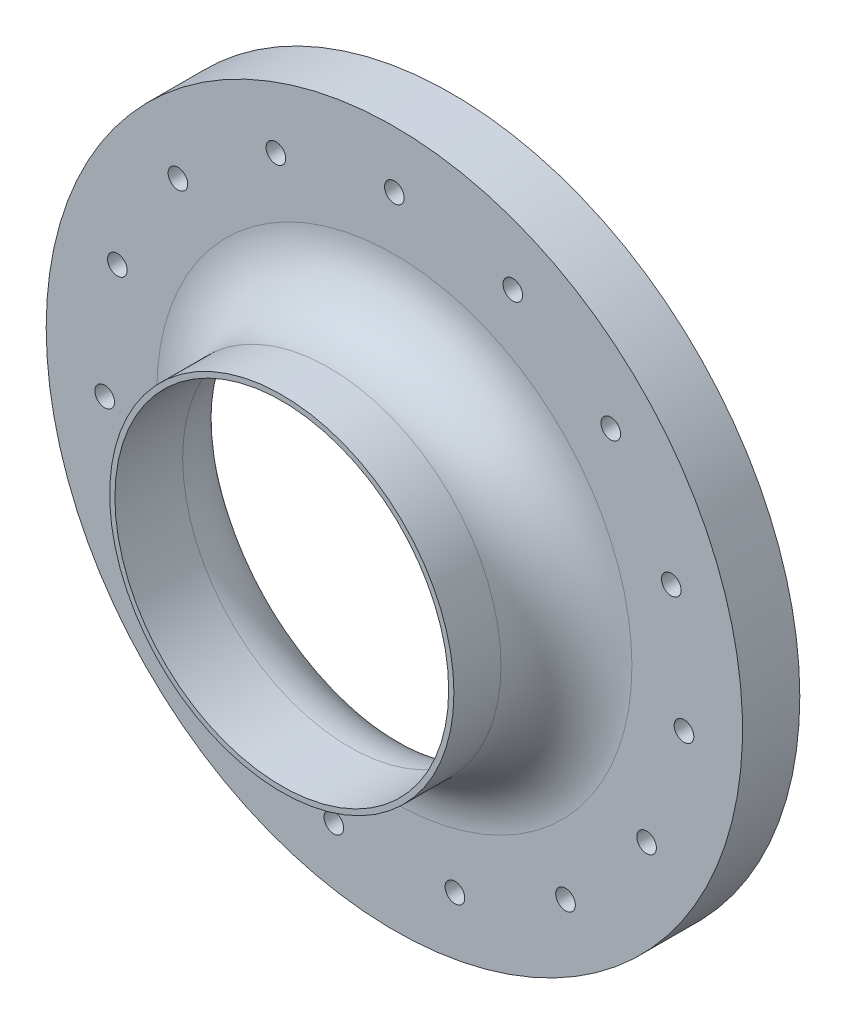
ISO-10303-21;
HEADER;
FILE_DESCRIPTION(('STEP AP214'),'2;1');
FILE_NAME('part.step','',(''),(''),'','','');
FILE_SCHEMA(('AUTOMOTIVE_DESIGN { 1 0 10303 214 1 1 1 1 }'));
ENDSEC;
DATA;
#1=APPLICATION_CONTEXT('core data for automotive mechanical design processes');
#2=APPLICATION_PROTOCOL_DEFINITION('international standard','automotive_design',2000,#1);
#3=PRODUCT_CONTEXT('',#1,'mechanical');
#4=PRODUCT('Part','Part','',(#3));
#5=PRODUCT_RELATED_PRODUCT_CATEGORY('part','',(#4));
#6=PRODUCT_DEFINITION_FORMATION('','',#4);
#7=PRODUCT_DEFINITION_CONTEXT('part definition',#1,'design');
#8=PRODUCT_DEFINITION('design','',#6,#7);
#9=PRODUCT_DEFINITION_SHAPE('','',#8);
#10=(LENGTH_UNIT() NAMED_UNIT(*) SI_UNIT(.MILLI.,.METRE.));
#11=(NAMED_UNIT(*) PLANE_ANGLE_UNIT() SI_UNIT($,.RADIAN.));
#12=(NAMED_UNIT(*) SI_UNIT($,.STERADIAN.) SOLID_ANGLE_UNIT());
#13=UNCERTAINTY_MEASURE_WITH_UNIT(LENGTH_MEASURE(1.E-05),#10,'distance_accuracy_value','');
#14=(GEOMETRIC_REPRESENTATION_CONTEXT(3) GLOBAL_UNCERTAINTY_ASSIGNED_CONTEXT((#13)) GLOBAL_UNIT_ASSIGNED_CONTEXT((#10,
#11,#12)) REPRESENTATION_CONTEXT('',''));
#15=CARTESIAN_POINT('',(0.,0.,0.));
#16=DIRECTION('',(0.,0.,1.));
#17=DIRECTION('',(1.,0.,0.));
#18=AXIS2_PLACEMENT_3D('',#15,#16,#17);
#19=CARTESIAN_POINT('',(0.,0.,-27.8));
#20=DIRECTION('',(0.,0.,1.));
#21=DIRECTION('',(1.,0.,0.));
#22=AXIS2_PLACEMENT_3D('',#19,#20,#21);
#23=TOROIDAL_SURFACE('',#22,46.5,6.95000000000001);
#24=CARTESIAN_POINT('',(0.,0.,-20.85));
#25=DIRECTION('',(0.,0.,1.));
#26=DIRECTION('',(1.,0.,0.));
#27=AXIS2_PLACEMENT_3D('',#24,#25,#26);
#28=CIRCLE('',#27,46.5);
#29=CARTESIAN_POINT('',(46.5,0.,-20.85));
#30=VERTEX_POINT('',#29);
#31=EDGE_CURVE('E51',#30,#30,#28,.T.);
#32=ORIENTED_EDGE('',*,*,#31,.T.);
#33=EDGE_LOOP('',(#32));
#34=FACE_BOUND('',#33,.T.);
#35=CARTESIAN_POINT('',(0.,0.,-25.9527046798089));
#36=DIRECTION('',(0.,0.,-1.));
#37=DIRECTION('',(-1.,0.,0.));
#38=AXIS2_PLACEMENT_3D('',#35,#36,#37);
#39=CIRCLE('',#38,53.2);
#40=CARTESIAN_POINT('',(-53.2,0.,-25.9527046798089));
#41=VERTEX_POINT('',#40);
#42=EDGE_CURVE('E121',#41,#41,#39,.F.);
#43=ORIENTED_EDGE('',*,*,#42,.F.);
#44=EDGE_LOOP('',(#43));
#45=FACE_BOUND('',#44,.T.);
#46=ADVANCED_FACE('F39',(#34,#45),#23,.F.);
#47=CARTESIAN_POINT('',(0.,36.3,-17.2));
#48=DIRECTION('',(0.,0.,-1.));
#49=DIRECTION('',(-1.,0.,0.));
#50=AXIS2_PLACEMENT_3D('',#47,#48,#49);
#51=PLANE('',#50);
#52=CARTESIAN_POINT('',(0.,0.,-17.2));
#53=DIRECTION('',(0.,0.,1.));
#54=DIRECTION('',(1.,0.,0.));
#55=AXIS2_PLACEMENT_3D('',#52,#53,#54);
#56=CIRCLE('',#55,36.3);
#57=CARTESIAN_POINT('',(36.3,0.,-17.2));
#58=VERTEX_POINT('',#57);
#59=EDGE_CURVE('E56',#58,#58,#56,.T.);
#60=ORIENTED_EDGE('',*,*,#59,.F.);
#61=EDGE_LOOP('',(#60));
#62=FACE_BOUND('',#61,.T.);
#63=CARTESIAN_POINT('',(0.,44.5,-17.2));
#64=DIRECTION('',(0.,0.,1.));
#65=DIRECTION('',(1.,0.,0.));
#66=AXIS2_PLACEMENT_3D('',#63,#64,#65);
#67=CIRCLE('',#66,1.5);
#68=CARTESIAN_POINT('',(1.5,44.5,-17.2));
#69=VERTEX_POINT('',#68);
#70=EDGE_CURVE('E71',#69,#69,#67,.T.);
#71=ORIENTED_EDGE('',*,*,#70,.F.);
#72=EDGE_LOOP('',(#71));
#73=FACE_BOUND('',#72,.T.);
#74=CARTESIAN_POINT('',(-18.0997806168731,40.6527728650957,-17.2));
#75=DIRECTION('',(0.,0.,1.));
#76=DIRECTION('',(1.,0.,0.));
#77=AXIS2_PLACEMENT_3D('',#74,#75,#76);
#78=CIRCLE('',#77,1.5);
#79=CARTESIAN_POINT('',(-16.5997806168731,40.6527728650957,-17.2));
#80=VERTEX_POINT('',#79);
#81=EDGE_CURVE('E117',#80,#80,#78,.T.);
#82=ORIENTED_EDGE('',*,*,#81,.F.);
#83=EDGE_LOOP('',(#82));
#84=FACE_BOUND('',#83,.T.);
#85=CARTESIAN_POINT('',(-33.0699447337441,29.7763119829692,-17.2));
#86=DIRECTION('',(0.,0.,1.));
#87=DIRECTION('',(1.,0.,0.));
#88=AXIS2_PLACEMENT_3D('',#85,#86,#87);
#89=CIRCLE('',#88,1.5);
#90=CARTESIAN_POINT('',(-31.5699447337441,29.7763119829692,-17.2));
#91=VERTEX_POINT('',#90);
#92=EDGE_CURVE('E120',#91,#91,#89,.T.);
#93=ORIENTED_EDGE('',*,*,#92,.F.);
#94=EDGE_LOOP('',(#93));
#95=FACE_BOUND('',#94,.T.);
#96=CARTESIAN_POINT('',(-42.3220149751344,13.7512562496852,-17.2));
#97=DIRECTION('',(0.,0.,1.));
#98=DIRECTION('',(1.,0.,0.));
#99=AXIS2_PLACEMENT_3D('',#96,#97,#98);
#100=CIRCLE('',#99,1.50000000000103);
#101=CARTESIAN_POINT('',(-40.8220149751333,13.7512562496852,-17.2));
#102=VERTEX_POINT('',#101);
#103=EDGE_CURVE('E124',#102,#102,#100,.T.);
#104=ORIENTED_EDGE('',*,*,#103,.F.);
#105=EDGE_LOOP('',(#104));
#106=FACE_BOUND('',#105,.T.);
#107=CARTESIAN_POINT('',(-44.2562243438882,-4.65151661541059,-17.2));
#108=DIRECTION('',(0.,0.,1.));
#109=DIRECTION('',(1.,0.,0.));
#110=AXIS2_PLACEMENT_3D('',#107,#108,#109);
#111=CIRCLE('',#110,1.50000000000126);
#112=CARTESIAN_POINT('',(-42.7562243438869,-4.65151661541059,-17.2));
#113=VERTEX_POINT('',#112);
#114=EDGE_CURVE('E127',#113,#113,#111,.T.);
#115=ORIENTED_EDGE('',*,*,#114,.F.);
#116=EDGE_LOOP('',(#115));
#117=FACE_BOUND('',#116,.T.);
#118=CARTESIAN_POINT('',(-38.5381304684076,-22.25,-17.2));
#119=DIRECTION('',(0.,0.,1.));
#120=DIRECTION('',(1.,0.,0.));
#121=AXIS2_PLACEMENT_3D('',#118,#119,#120);
#122=CIRCLE('',#121,1.50000000000039);
#123=CARTESIAN_POINT('',(-37.0381304684072,-22.25,-17.2));
#124=VERTEX_POINT('',#123);
#125=EDGE_CURVE('E130',#124,#124,#122,.T.);
#126=ORIENTED_EDGE('',*,*,#125,.F.);
#127=EDGE_LOOP('',(#126));
#128=FACE_BOUND('',#127,.T.);
#129=CARTESIAN_POINT('',(-26.1564437270151,-36.0012562496852,-17.2));
#130=DIRECTION('',(0.,0.,1.));
#131=DIRECTION('',(1.,0.,0.));
#132=AXIS2_PLACEMENT_3D('',#129,#130,#131);
#133=CIRCLE('',#132,1.50000000000034);
#134=CARTESIAN_POINT('',(-24.6564437270147,-36.0012562496852,-17.2));
#135=VERTEX_POINT('',#134);
#136=EDGE_CURVE('E133',#135,#135,#133,.T.);
#137=ORIENTED_EDGE('',*,*,#136,.F.);
#138=EDGE_LOOP('',(#137));
#139=FACE_BOUND('',#138,.T.);
#140=CARTESIAN_POINT('',(-9.25207024139029,-43.5275682326544,-17.2));
#141=DIRECTION('',(0.,0.,1.));
#142=DIRECTION('',(1.,0.,0.));
#143=AXIS2_PLACEMENT_3D('',#140,#141,#142);
#144=CIRCLE('',#143,1.50000000000031);
#145=CARTESIAN_POINT('',(-7.75207024138998,-43.5275682326544,-17.2));
#146=VERTEX_POINT('',#145);
#147=EDGE_CURVE('E136',#146,#146,#144,.T.);
#148=ORIENTED_EDGE('',*,*,#147,.F.);
#149=EDGE_LOOP('',(#148));
#150=FACE_BOUND('',#149,.T.);
#151=CARTESIAN_POINT('',(9.2520702413903,-43.5275682326544,-17.2));
#152=DIRECTION('',(0.,0.,1.));
#153=DIRECTION('',(1.,0.,0.));
#154=AXIS2_PLACEMENT_3D('',#151,#152,#153);
#155=CIRCLE('',#154,1.50000000000026);
#156=CARTESIAN_POINT('',(10.7520702413906,-43.5275682326544,-17.2));
#157=VERTEX_POINT('',#156);
#158=EDGE_CURVE('E139',#157,#157,#155,.T.);
#159=ORIENTED_EDGE('',*,*,#158,.F.);
#160=EDGE_LOOP('',(#159));
#161=FACE_BOUND('',#160,.T.);
#162=CARTESIAN_POINT('',(26.1564437270151,-36.0012562496852,-17.2));
#163=DIRECTION('',(0.,0.,1.));
#164=DIRECTION('',(1.,0.,0.));
#165=AXIS2_PLACEMENT_3D('',#162,#163,#164);
#166=CIRCLE('',#165,1.50000000000021);
#167=CARTESIAN_POINT('',(27.6564437270153,-36.0012562496852,-17.2));
#168=VERTEX_POINT('',#167);
#169=EDGE_CURVE('E142',#168,#168,#166,.T.);
#170=ORIENTED_EDGE('',*,*,#169,.F.);
#171=EDGE_LOOP('',(#170));
#172=FACE_BOUND('',#171,.T.);
#173=CARTESIAN_POINT('',(38.5381304684075,-22.25,-17.2));
#174=DIRECTION('',(0.,0.,1.));
#175=DIRECTION('',(1.,0.,0.));
#176=AXIS2_PLACEMENT_3D('',#173,#174,#175);
#177=CIRCLE('',#176,1.5000000000002);
#178=CARTESIAN_POINT('',(40.0381304684077,-22.25,-17.2));
#179=VERTEX_POINT('',#178);
#180=EDGE_CURVE('E145',#179,#179,#177,.T.);
#181=ORIENTED_EDGE('',*,*,#180,.F.);
#182=EDGE_LOOP('',(#181));
#183=FACE_BOUND('',#182,.T.);
#184=CARTESIAN_POINT('',(44.2562243438882,-4.65151661541058,-17.2));
#185=DIRECTION('',(0.,0.,1.));
#186=DIRECTION('',(1.,0.,0.));
#187=AXIS2_PLACEMENT_3D('',#184,#185,#186);
#188=CIRCLE('',#187,1.50000000000063);
#189=CARTESIAN_POINT('',(45.7562243438888,-4.65151661541058,-17.2));
#190=VERTEX_POINT('',#189);
#191=EDGE_CURVE('E148',#190,#190,#188,.T.);
#192=ORIENTED_EDGE('',*,*,#191,.F.);
#193=EDGE_LOOP('',(#192));
#194=FACE_BOUND('',#193,.T.);
#195=CARTESIAN_POINT('',(42.3220149751343,13.7512562496852,-17.2));
#196=DIRECTION('',(0.,0.,1.));
#197=DIRECTION('',(1.,0.,0.));
#198=AXIS2_PLACEMENT_3D('',#195,#196,#197);
#199=CIRCLE('',#198,1.5);
#200=CARTESIAN_POINT('',(43.8220149751343,13.7512562496852,-17.2));
#201=VERTEX_POINT('',#200);
#202=EDGE_CURVE('E151',#201,#201,#199,.T.);
#203=ORIENTED_EDGE('',*,*,#202,.F.);
#204=EDGE_LOOP('',(#203));
#205=FACE_BOUND('',#204,.T.);
#206=CARTESIAN_POINT('',(33.0699447337441,29.7763119829692,-17.2));
#207=DIRECTION('',(0.,0.,1.));
#208=DIRECTION('',(1.,0.,0.));
#209=AXIS2_PLACEMENT_3D('',#206,#207,#208);
#210=CIRCLE('',#209,1.5);
#211=CARTESIAN_POINT('',(34.5699447337441,29.7763119829692,-17.2));
#212=VERTEX_POINT('',#211);
#213=EDGE_CURVE('E154',#212,#212,#210,.T.);
#214=ORIENTED_EDGE('',*,*,#213,.F.);
#215=EDGE_LOOP('',(#214));
#216=FACE_BOUND('',#215,.T.);
#217=CARTESIAN_POINT('',(18.0997806168731,40.6527728650957,-17.2));
#218=DIRECTION('',(0.,0.,1.));
#219=DIRECTION('',(1.,0.,0.));
#220=AXIS2_PLACEMENT_3D('',#217,#218,#219);
#221=CIRCLE('',#220,1.5);
#222=CARTESIAN_POINT('',(19.5997806168731,40.6527728650957,-17.2));
#223=VERTEX_POINT('',#222);
#224=EDGE_CURVE('E116',#223,#223,#221,.T.);
#225=ORIENTED_EDGE('',*,*,#224,.F.);
#226=EDGE_LOOP('',(#225));
#227=FACE_BOUND('',#226,.T.);
#228=CARTESIAN_POINT('',(0.,0.,-17.2));
#229=DIRECTION('',(0.,0.,-1.));
#230=DIRECTION('',(-1.,0.,0.));
#231=AXIS2_PLACEMENT_3D('',#228,#229,#230);
#232=CIRCLE('',#231,53.2);
#233=CARTESIAN_POINT('',(-53.2,0.,-17.2));
#234=VERTEX_POINT('',#233);
#235=EDGE_CURVE('E43',#234,#234,#232,.T.);
#236=ORIENTED_EDGE('',*,*,#235,.F.);
#237=EDGE_LOOP('',(#236));
#238=FACE_BOUND('',#237,.T.);
#239=ADVANCED_FACE('F167',(#62,#73,#84,#95,#106,#117,#128,#139,#150,#161,#172,#183,#194,#205,
#216,#227,#238),#51,.F.);
#240=CARTESIAN_POINT('',(0.,0.,0.));
#241=DIRECTION('',(0.,0.,1.));
#242=DIRECTION('',(1.,0.,0.));
#243=AXIS2_PLACEMENT_3D('',#240,#241,#242);
#244=CYLINDRICAL_SURFACE('',#243,25.5);
#245=CARTESIAN_POINT('',(0.,0.,-10.35));
#246=DIRECTION('',(0.,0.,1.));
#247=DIRECTION('',(1.,0.,0.));
#248=AXIS2_PLACEMENT_3D('',#245,#246,#247);
#249=CIRCLE('',#248,25.5);
#250=CARTESIAN_POINT('',(25.5,0.,-10.35));
#251=VERTEX_POINT('',#250);
#252=EDGE_CURVE('E10',#251,#251,#249,.T.);
#253=ORIENTED_EDGE('',*,*,#252,.F.);
#254=EDGE_LOOP('',(#253));
#255=FACE_BOUND('',#254,.T.);
#256=CARTESIAN_POINT('',(0.,0.,0.));
#257=DIRECTION('',(0.,0.,1.));
#258=DIRECTION('',(1.,0.,0.));
#259=AXIS2_PLACEMENT_3D('',#256,#257,#258);
#260=CIRCLE('',#259,25.5);
#261=CARTESIAN_POINT('',(25.5,0.,0.));
#262=VERTEX_POINT('',#261);
#263=EDGE_CURVE('E65',#262,#262,#260,.T.);
#264=ORIENTED_EDGE('',*,*,#263,.T.);
#265=EDGE_LOOP('',(#264));
#266=FACE_BOUND('',#265,.T.);
#267=ADVANCED_FACE('F41',(#255,#266),#244,.F.);
#268=CARTESIAN_POINT('',(0.,0.,-10.35));
#269=DIRECTION('',(0.,0.,1.));
#270=DIRECTION('',(1.,0.,0.));
#271=AXIS2_PLACEMENT_3D('',#268,#269,#270);
#272=TOROIDAL_SURFACE('',#271,36.,10.5);
#273=CARTESIAN_POINT('',(0.,0.,-20.85));
#274=DIRECTION('',(0.,0.,1.));
#275=DIRECTION('',(1.,0.,0.));
#276=AXIS2_PLACEMENT_3D('',#273,#274,#275);
#277=CIRCLE('',#276,36.);
#278=CARTESIAN_POINT('',(36.,0.,-20.85));
#279=VERTEX_POINT('',#278);
#280=EDGE_CURVE('E47',#279,#279,#277,.T.);
#281=ORIENTED_EDGE('',*,*,#280,.F.);
#282=EDGE_LOOP('',(#281));
#283=FACE_BOUND('',#282,.T.);
#284=ORIENTED_EDGE('',*,*,#252,.T.);
#285=EDGE_LOOP('',(#284));
#286=FACE_BOUND('',#285,.T.);
#287=ADVANCED_FACE('F175',(#283,#286),#272,.T.);
#288=CARTESIAN_POINT('',(0.,46.5,-20.85));
#289=DIRECTION('',(0.,0.,1.));
#290=DIRECTION('',(1.,0.,0.));
#291=AXIS2_PLACEMENT_3D('',#288,#289,#290);
#292=PLANE('',#291);
#293=CARTESIAN_POINT('',(18.0997806168731,40.6527728650957,-20.85));
#294=DIRECTION('',(0.,0.,1.));
#295=DIRECTION('',(1.,0.,0.));
#296=AXIS2_PLACEMENT_3D('',#293,#294,#295);
#297=CIRCLE('',#296,1.5);
#298=CARTESIAN_POINT('',(19.5997806168731,40.6527728650957,-20.85));
#299=VERTEX_POINT('',#298);
#300=EDGE_CURVE('E74',#299,#299,#297,.T.);
#301=ORIENTED_EDGE('',*,*,#300,.T.);
#302=EDGE_LOOP('',(#301));
#303=FACE_BOUND('',#302,.T.);
#304=CARTESIAN_POINT('',(33.0699447337441,29.7763119829692,-20.85));
#305=DIRECTION('',(0.,0.,1.));
#306=DIRECTION('',(1.,0.,0.));
#307=AXIS2_PLACEMENT_3D('',#304,#305,#306);
#308=CIRCLE('',#307,1.5);
#309=CARTESIAN_POINT('',(34.5699447337441,29.7763119829692,-20.85));
#310=VERTEX_POINT('',#309);
#311=EDGE_CURVE('E77',#310,#310,#308,.T.);
#312=ORIENTED_EDGE('',*,*,#311,.T.);
#313=EDGE_LOOP('',(#312));
#314=FACE_BOUND('',#313,.T.);
#315=CARTESIAN_POINT('',(42.3220149751343,13.7512562496852,-20.85));
#316=DIRECTION('',(0.,0.,1.));
#317=DIRECTION('',(1.,0.,0.));
#318=AXIS2_PLACEMENT_3D('',#315,#316,#317);
#319=CIRCLE('',#318,1.5);
#320=CARTESIAN_POINT('',(43.8220149751343,13.7512562496852,-20.85));
#321=VERTEX_POINT('',#320);
#322=EDGE_CURVE('E80',#321,#321,#319,.T.);
#323=ORIENTED_EDGE('',*,*,#322,.T.);
#324=EDGE_LOOP('',(#323));
#325=FACE_BOUND('',#324,.T.);
#326=CARTESIAN_POINT('',(44.2562243438882,-4.65151661541058,-20.85));
#327=DIRECTION('',(0.,0.,1.));
#328=DIRECTION('',(1.,0.,0.));
#329=AXIS2_PLACEMENT_3D('',#326,#327,#328);
#330=CIRCLE('',#329,1.50000000000063);
#331=CARTESIAN_POINT('',(45.7562243438888,-4.65151661541058,-20.85));
#332=VERTEX_POINT('',#331);
#333=EDGE_CURVE('E83',#332,#332,#330,.T.);
#334=ORIENTED_EDGE('',*,*,#333,.T.);
#335=EDGE_LOOP('',(#334));
#336=FACE_BOUND('',#335,.T.);
#337=CARTESIAN_POINT('',(38.5381304684075,-22.25,-20.85));
#338=DIRECTION('',(0.,0.,1.));
#339=DIRECTION('',(1.,0.,0.));
#340=AXIS2_PLACEMENT_3D('',#337,#338,#339);
#341=CIRCLE('',#340,1.5000000000002);
#342=CARTESIAN_POINT('',(40.0381304684077,-22.25,-20.85));
#343=VERTEX_POINT('',#342);
#344=EDGE_CURVE('E86',#343,#343,#341,.T.);
#345=ORIENTED_EDGE('',*,*,#344,.T.);
#346=EDGE_LOOP('',(#345));
#347=FACE_BOUND('',#346,.T.);
#348=CARTESIAN_POINT('',(26.1564437270151,-36.0012562496852,-20.85));
#349=DIRECTION('',(0.,0.,1.));
#350=DIRECTION('',(1.,0.,0.));
#351=AXIS2_PLACEMENT_3D('',#348,#349,#350);
#352=CIRCLE('',#351,1.50000000000021);
#353=CARTESIAN_POINT('',(27.6564437270153,-36.0012562496852,-20.85));
#354=VERTEX_POINT('',#353);
#355=EDGE_CURVE('E89',#354,#354,#352,.T.);
#356=ORIENTED_EDGE('',*,*,#355,.T.);
#357=EDGE_LOOP('',(#356));
#358=FACE_BOUND('',#357,.T.);
#359=CARTESIAN_POINT('',(9.2520702413903,-43.5275682326544,-20.85));
#360=DIRECTION('',(0.,0.,1.));
#361=DIRECTION('',(1.,0.,0.));
#362=AXIS2_PLACEMENT_3D('',#359,#360,#361);
#363=CIRCLE('',#362,1.50000000000026);
#364=CARTESIAN_POINT('',(10.7520702413906,-43.5275682326544,-20.85));
#365=VERTEX_POINT('',#364);
#366=EDGE_CURVE('E92',#365,#365,#363,.T.);
#367=ORIENTED_EDGE('',*,*,#366,.T.);
#368=EDGE_LOOP('',(#367));
#369=FACE_BOUND('',#368,.T.);
#370=CARTESIAN_POINT('',(-9.25207024139029,-43.5275682326544,-20.85));
#371=DIRECTION('',(0.,0.,1.));
#372=DIRECTION('',(1.,0.,0.));
#373=AXIS2_PLACEMENT_3D('',#370,#371,#372);
#374=CIRCLE('',#373,1.50000000000031);
#375=CARTESIAN_POINT('',(-7.75207024138998,-43.5275682326544,-20.85));
#376=VERTEX_POINT('',#375);
#377=EDGE_CURVE('E95',#376,#376,#374,.T.);
#378=ORIENTED_EDGE('',*,*,#377,.T.);
#379=EDGE_LOOP('',(#378));
#380=FACE_BOUND('',#379,.T.);
#381=CARTESIAN_POINT('',(-26.1564437270151,-36.0012562496852,-20.85));
#382=DIRECTION('',(0.,0.,1.));
#383=DIRECTION('',(1.,0.,0.));
#384=AXIS2_PLACEMENT_3D('',#381,#382,#383);
#385=CIRCLE('',#384,1.50000000000034);
#386=CARTESIAN_POINT('',(-24.6564437270147,-36.0012562496852,-20.85));
#387=VERTEX_POINT('',#386);
#388=EDGE_CURVE('E98',#387,#387,#385,.T.);
#389=ORIENTED_EDGE('',*,*,#388,.T.);
#390=EDGE_LOOP('',(#389));
#391=FACE_BOUND('',#390,.T.);
#392=CARTESIAN_POINT('',(-38.5381304684076,-22.25,-20.85));
#393=DIRECTION('',(0.,0.,1.));
#394=DIRECTION('',(1.,0.,0.));
#395=AXIS2_PLACEMENT_3D('',#392,#393,#394);
#396=CIRCLE('',#395,1.50000000000039);
#397=CARTESIAN_POINT('',(-37.0381304684072,-22.25,-20.85));
#398=VERTEX_POINT('',#397);
#399=EDGE_CURVE('E101',#398,#398,#396,.T.);
#400=ORIENTED_EDGE('',*,*,#399,.T.);
#401=EDGE_LOOP('',(#400));
#402=FACE_BOUND('',#401,.T.);
#403=CARTESIAN_POINT('',(-44.2562243438882,-4.65151661541059,-20.85));
#404=DIRECTION('',(0.,0.,1.));
#405=DIRECTION('',(1.,0.,0.));
#406=AXIS2_PLACEMENT_3D('',#403,#404,#405);
#407=CIRCLE('',#406,1.50000000000126);
#408=CARTESIAN_POINT('',(-42.7562243438869,-4.65151661541059,-20.85));
#409=VERTEX_POINT('',#408);
#410=EDGE_CURVE('E104',#409,#409,#407,.T.);
#411=ORIENTED_EDGE('',*,*,#410,.T.);
#412=EDGE_LOOP('',(#411));
#413=FACE_BOUND('',#412,.T.);
#414=CARTESIAN_POINT('',(-42.3220149751344,13.7512562496852,-20.85));
#415=DIRECTION('',(0.,0.,1.));
#416=DIRECTION('',(1.,0.,0.));
#417=AXIS2_PLACEMENT_3D('',#414,#415,#416);
#418=CIRCLE('',#417,1.50000000000103);
#419=CARTESIAN_POINT('',(-40.8220149751333,13.7512562496852,-20.85));
#420=VERTEX_POINT('',#419);
#421=EDGE_CURVE('E107',#420,#420,#418,.T.);
#422=ORIENTED_EDGE('',*,*,#421,.T.);
#423=EDGE_LOOP('',(#422));
#424=FACE_BOUND('',#423,.T.);
#425=CARTESIAN_POINT('',(-33.0699447337441,29.7763119829692,-20.85));
#426=DIRECTION('',(0.,0.,1.));
#427=DIRECTION('',(1.,0.,0.));
#428=AXIS2_PLACEMENT_3D('',#425,#426,#427);
#429=CIRCLE('',#428,1.5);
#430=CARTESIAN_POINT('',(-31.5699447337441,29.7763119829692,-20.85));
#431=VERTEX_POINT('',#430);
#432=EDGE_CURVE('E110',#431,#431,#429,.T.);
#433=ORIENTED_EDGE('',*,*,#432,.T.);
#434=EDGE_LOOP('',(#433));
#435=FACE_BOUND('',#434,.T.);
#436=CARTESIAN_POINT('',(-18.0997806168731,40.6527728650957,-20.85));
#437=DIRECTION('',(0.,0.,1.));
#438=DIRECTION('',(1.,0.,0.));
#439=AXIS2_PLACEMENT_3D('',#436,#437,#438);
#440=CIRCLE('',#439,1.5);
#441=CARTESIAN_POINT('',(-16.5997806168731,40.6527728650957,-20.85));
#442=VERTEX_POINT('',#441);
#443=EDGE_CURVE('E113',#442,#442,#440,.T.);
#444=ORIENTED_EDGE('',*,*,#443,.T.);
#445=EDGE_LOOP('',(#444));
#446=FACE_BOUND('',#445,.T.);
#447=CARTESIAN_POINT('',(0.,44.5,-20.85));
#448=DIRECTION('',(0.,0.,1.));
#449=DIRECTION('',(1.,0.,0.));
#450=AXIS2_PLACEMENT_3D('',#447,#448,#449);
#451=CIRCLE('',#450,1.5);
#452=CARTESIAN_POINT('',(1.5,44.5,-20.85));
#453=VERTEX_POINT('',#452);
#454=EDGE_CURVE('E68',#453,#453,#451,.T.);
#455=ORIENTED_EDGE('',*,*,#454,.T.);
#456=EDGE_LOOP('',(#455));
#457=FACE_BOUND('',#456,.T.);
#458=ORIENTED_EDGE('',*,*,#31,.F.);
#459=EDGE_LOOP('',(#458));
#460=FACE_BOUND('',#459,.T.);
#461=ORIENTED_EDGE('',*,*,#280,.T.);
#462=EDGE_LOOP('',(#461));
#463=FACE_BOUND('',#462,.T.);
#464=ADVANCED_FACE('F185',(#303,#314,#325,#336,#347,#358,#369,#380,#391,#402,#413,#424,#435,
#446,#457,#460,#463),#292,.F.);
#465=CARTESIAN_POINT('',(0.,0.,-7.2));
#466=DIRECTION('',(0.,0.,1.));
#467=DIRECTION('',(1.,0.,0.));
#468=AXIS2_PLACEMENT_3D('',#465,#466,#467);
#469=TOROIDAL_SURFACE('',#468,36.3,9.99999999999999);
#470=CARTESIAN_POINT('',(0.,0.,-7.2));
#471=DIRECTION('',(0.,0.,1.));
#472=DIRECTION('',(1.,0.,0.));
#473=AXIS2_PLACEMENT_3D('',#470,#471,#472);
#474=CIRCLE('',#473,26.3);
#475=CARTESIAN_POINT('',(26.3,0.,-7.2));
#476=VERTEX_POINT('',#475);
#477=EDGE_CURVE('E59',#476,#476,#474,.T.);
#478=ORIENTED_EDGE('',*,*,#477,.F.);
#479=EDGE_LOOP('',(#478));
#480=FACE_BOUND('',#479,.T.);
#481=ORIENTED_EDGE('',*,*,#59,.T.);
#482=EDGE_LOOP('',(#481));
#483=FACE_BOUND('',#482,.T.);
#484=ADVANCED_FACE('F182',(#480,#483),#469,.F.);
#485=CARTESIAN_POINT('',(0.,0.,0.));
#486=DIRECTION('',(0.,0.,1.));
#487=DIRECTION('',(1.,0.,0.));
#488=AXIS2_PLACEMENT_3D('',#485,#486,#487);
#489=CYLINDRICAL_SURFACE('',#488,26.3);
#490=CARTESIAN_POINT('',(0.,0.,0.));
#491=DIRECTION('',(0.,0.,1.));
#492=DIRECTION('',(1.,0.,0.));
#493=AXIS2_PLACEMENT_3D('',#490,#491,#492);
#494=CIRCLE('',#493,26.3);
#495=CARTESIAN_POINT('',(26.3,0.,0.));
#496=VERTEX_POINT('',#495);
#497=EDGE_CURVE('E62',#496,#496,#494,.T.);
#498=ORIENTED_EDGE('',*,*,#497,.F.);
#499=EDGE_LOOP('',(#498));
#500=FACE_BOUND('',#499,.T.);
#501=ORIENTED_EDGE('',*,*,#477,.T.);
#502=EDGE_LOOP('',(#501));
#503=FACE_BOUND('',#502,.T.);
#504=ADVANCED_FACE('F208',(#500,#503),#489,.T.);
#505=CARTESIAN_POINT('',(0.,25.5,0.));
#506=DIRECTION('',(0.,0.,-1.));
#507=DIRECTION('',(-1.,0.,0.));
#508=AXIS2_PLACEMENT_3D('',#505,#506,#507);
#509=PLANE('',#508);
#510=ORIENTED_EDGE('',*,*,#263,.F.);
#511=EDGE_LOOP('',(#510));
#512=FACE_BOUND('',#511,.T.);
#513=ORIENTED_EDGE('',*,*,#497,.T.);
#514=EDGE_LOOP('',(#513));
#515=FACE_BOUND('',#514,.T.);
#516=ADVANCED_FACE('F215',(#512,#515),#509,.F.);
#517=CARTESIAN_POINT('',(0.,44.5,-32.8));
#518=DIRECTION('',(0.,0.,1.));
#519=DIRECTION('',(1.,0.,0.));
#520=AXIS2_PLACEMENT_3D('',#517,#518,#519);
#521=CYLINDRICAL_SURFACE('',#520,1.5);
#522=ORIENTED_EDGE('',*,*,#70,.T.);
#523=EDGE_LOOP('',(#522));
#524=FACE_BOUND('',#523,.T.);
#525=ORIENTED_EDGE('',*,*,#454,.F.);
#526=EDGE_LOOP('',(#525));
#527=FACE_BOUND('',#526,.T.);
#528=ADVANCED_FACE('F221',(#524,#527),#521,.F.);
#529=CARTESIAN_POINT('',(-18.0997806168731,40.6527728650957,-32.8));
#530=DIRECTION('',(0.,0.,1.));
#531=DIRECTION('',(1.,0.,0.));
#532=AXIS2_PLACEMENT_3D('',#529,#530,#531);
#533=CYLINDRICAL_SURFACE('',#532,1.5);
#534=ORIENTED_EDGE('',*,*,#81,.T.);
#535=EDGE_LOOP('',(#534));
#536=FACE_BOUND('',#535,.T.);
#537=ORIENTED_EDGE('',*,*,#443,.F.);
#538=EDGE_LOOP('',(#537));
#539=FACE_BOUND('',#538,.T.);
#540=ADVANCED_FACE('F228',(#536,#539),#533,.F.);
#541=CARTESIAN_POINT('',(-33.0699447337441,29.7763119829692,-32.8));
#542=DIRECTION('',(0.,0.,1.));
#543=DIRECTION('',(1.,0.,0.));
#544=AXIS2_PLACEMENT_3D('',#541,#542,#543);
#545=CYLINDRICAL_SURFACE('',#544,1.5);
#546=ORIENTED_EDGE('',*,*,#92,.T.);
#547=EDGE_LOOP('',(#546));
#548=FACE_BOUND('',#547,.T.);
#549=ORIENTED_EDGE('',*,*,#432,.F.);
#550=EDGE_LOOP('',(#549));
#551=FACE_BOUND('',#550,.T.);
#552=ADVANCED_FACE('F236',(#548,#551),#545,.F.);
#553=CARTESIAN_POINT('',(-42.3220149751344,13.7512562496852,-32.8));
#554=DIRECTION('',(0.,0.,1.));
#555=DIRECTION('',(1.,0.,0.));
#556=AXIS2_PLACEMENT_3D('',#553,#554,#555);
#557=CYLINDRICAL_SURFACE('',#556,1.50000000000103);
#558=ORIENTED_EDGE('',*,*,#103,.T.);
#559=EDGE_LOOP('',(#558));
#560=FACE_BOUND('',#559,.T.);
#561=ORIENTED_EDGE('',*,*,#421,.F.);
#562=EDGE_LOOP('',(#561));
#563=FACE_BOUND('',#562,.T.);
#564=ADVANCED_FACE('F244',(#560,#563),#557,.F.);
#565=CARTESIAN_POINT('',(-44.2562243438882,-4.65151661541059,-32.8));
#566=DIRECTION('',(0.,0.,1.));
#567=DIRECTION('',(1.,0.,0.));
#568=AXIS2_PLACEMENT_3D('',#565,#566,#567);
#569=CYLINDRICAL_SURFACE('',#568,1.50000000000126);
#570=ORIENTED_EDGE('',*,*,#114,.T.);
#571=EDGE_LOOP('',(#570));
#572=FACE_BOUND('',#571,.T.);
#573=ORIENTED_EDGE('',*,*,#410,.F.);
#574=EDGE_LOOP('',(#573));
#575=FACE_BOUND('',#574,.T.);
#576=ADVANCED_FACE('F252',(#572,#575),#569,.F.);
#577=CARTESIAN_POINT('',(-38.5381304684076,-22.25,-32.8));
#578=DIRECTION('',(0.,0.,1.));
#579=DIRECTION('',(1.,0.,0.));
#580=AXIS2_PLACEMENT_3D('',#577,#578,#579);
#581=CYLINDRICAL_SURFACE('',#580,1.50000000000039);
#582=ORIENTED_EDGE('',*,*,#125,.T.);
#583=EDGE_LOOP('',(#582));
#584=FACE_BOUND('',#583,.T.);
#585=ORIENTED_EDGE('',*,*,#399,.F.);
#586=EDGE_LOOP('',(#585));
#587=FACE_BOUND('',#586,.T.);
#588=ADVANCED_FACE('F260',(#584,#587),#581,.F.);
#589=CARTESIAN_POINT('',(-26.1564437270151,-36.0012562496852,-32.8));
#590=DIRECTION('',(0.,0.,1.));
#591=DIRECTION('',(1.,0.,0.));
#592=AXIS2_PLACEMENT_3D('',#589,#590,#591);
#593=CYLINDRICAL_SURFACE('',#592,1.50000000000034);
#594=ORIENTED_EDGE('',*,*,#136,.T.);
#595=EDGE_LOOP('',(#594));
#596=FACE_BOUND('',#595,.T.);
#597=ORIENTED_EDGE('',*,*,#388,.F.);
#598=EDGE_LOOP('',(#597));
#599=FACE_BOUND('',#598,.T.);
#600=ADVANCED_FACE('F268',(#596,#599),#593,.F.);
#601=CARTESIAN_POINT('',(-9.25207024139029,-43.5275682326544,-32.8));
#602=DIRECTION('',(0.,0.,1.));
#603=DIRECTION('',(1.,0.,0.));
#604=AXIS2_PLACEMENT_3D('',#601,#602,#603);
#605=CYLINDRICAL_SURFACE('',#604,1.50000000000031);
#606=ORIENTED_EDGE('',*,*,#147,.T.);
#607=EDGE_LOOP('',(#606));
#608=FACE_BOUND('',#607,.T.);
#609=ORIENTED_EDGE('',*,*,#377,.F.);
#610=EDGE_LOOP('',(#609));
#611=FACE_BOUND('',#610,.T.);
#612=ADVANCED_FACE('F276',(#608,#611),#605,.F.);
#613=CARTESIAN_POINT('',(9.2520702413903,-43.5275682326544,-32.8));
#614=DIRECTION('',(0.,0.,1.));
#615=DIRECTION('',(1.,0.,0.));
#616=AXIS2_PLACEMENT_3D('',#613,#614,#615);
#617=CYLINDRICAL_SURFACE('',#616,1.50000000000026);
#618=ORIENTED_EDGE('',*,*,#158,.T.);
#619=EDGE_LOOP('',(#618));
#620=FACE_BOUND('',#619,.T.);
#621=ORIENTED_EDGE('',*,*,#366,.F.);
#622=EDGE_LOOP('',(#621));
#623=FACE_BOUND('',#622,.T.);
#624=ADVANCED_FACE('F284',(#620,#623),#617,.F.);
#625=CARTESIAN_POINT('',(26.1564437270151,-36.0012562496852,-32.8));
#626=DIRECTION('',(0.,0.,1.));
#627=DIRECTION('',(1.,0.,0.));
#628=AXIS2_PLACEMENT_3D('',#625,#626,#627);
#629=CYLINDRICAL_SURFACE('',#628,1.50000000000021);
#630=ORIENTED_EDGE('',*,*,#169,.T.);
#631=EDGE_LOOP('',(#630));
#632=FACE_BOUND('',#631,.T.);
#633=ORIENTED_EDGE('',*,*,#355,.F.);
#634=EDGE_LOOP('',(#633));
#635=FACE_BOUND('',#634,.T.);
#636=ADVANCED_FACE('F292',(#632,#635),#629,.F.);
#637=CARTESIAN_POINT('',(38.5381304684075,-22.25,-32.8));
#638=DIRECTION('',(0.,0.,1.));
#639=DIRECTION('',(1.,0.,0.));
#640=AXIS2_PLACEMENT_3D('',#637,#638,#639);
#641=CYLINDRICAL_SURFACE('',#640,1.5000000000002);
#642=ORIENTED_EDGE('',*,*,#180,.T.);
#643=EDGE_LOOP('',(#642));
#644=FACE_BOUND('',#643,.T.);
#645=ORIENTED_EDGE('',*,*,#344,.F.);
#646=EDGE_LOOP('',(#645));
#647=FACE_BOUND('',#646,.T.);
#648=ADVANCED_FACE('F300',(#644,#647),#641,.F.);
#649=CARTESIAN_POINT('',(44.2562243438882,-4.65151661541058,-32.8));
#650=DIRECTION('',(0.,0.,1.));
#651=DIRECTION('',(1.,0.,0.));
#652=AXIS2_PLACEMENT_3D('',#649,#650,#651);
#653=CYLINDRICAL_SURFACE('',#652,1.50000000000063);
#654=ORIENTED_EDGE('',*,*,#191,.T.);
#655=EDGE_LOOP('',(#654));
#656=FACE_BOUND('',#655,.T.);
#657=ORIENTED_EDGE('',*,*,#333,.F.);
#658=EDGE_LOOP('',(#657));
#659=FACE_BOUND('',#658,.T.);
#660=ADVANCED_FACE('F308',(#656,#659),#653,.F.);
#661=CARTESIAN_POINT('',(42.3220149751343,13.7512562496852,-32.8));
#662=DIRECTION('',(0.,0.,1.));
#663=DIRECTION('',(1.,0.,0.));
#664=AXIS2_PLACEMENT_3D('',#661,#662,#663);
#665=CYLINDRICAL_SURFACE('',#664,1.5);
#666=ORIENTED_EDGE('',*,*,#202,.T.);
#667=EDGE_LOOP('',(#666));
#668=FACE_BOUND('',#667,.T.);
#669=ORIENTED_EDGE('',*,*,#322,.F.);
#670=EDGE_LOOP('',(#669));
#671=FACE_BOUND('',#670,.T.);
#672=ADVANCED_FACE('F316',(#668,#671),#665,.F.);
#673=CARTESIAN_POINT('',(33.0699447337441,29.7763119829692,-32.8));
#674=DIRECTION('',(0.,0.,1.));
#675=DIRECTION('',(1.,0.,0.));
#676=AXIS2_PLACEMENT_3D('',#673,#674,#675);
#677=CYLINDRICAL_SURFACE('',#676,1.5);
#678=ORIENTED_EDGE('',*,*,#213,.T.);
#679=EDGE_LOOP('',(#678));
#680=FACE_BOUND('',#679,.T.);
#681=ORIENTED_EDGE('',*,*,#311,.F.);
#682=EDGE_LOOP('',(#681));
#683=FACE_BOUND('',#682,.T.);
#684=ADVANCED_FACE('F324',(#680,#683),#677,.F.);
#685=CARTESIAN_POINT('',(18.0997806168731,40.6527728650957,-32.8));
#686=DIRECTION('',(0.,0.,1.));
#687=DIRECTION('',(1.,0.,0.));
#688=AXIS2_PLACEMENT_3D('',#685,#686,#687);
#689=CYLINDRICAL_SURFACE('',#688,1.5);
#690=ORIENTED_EDGE('',*,*,#224,.T.);
#691=EDGE_LOOP('',(#690));
#692=FACE_BOUND('',#691,.T.);
#693=ORIENTED_EDGE('',*,*,#300,.F.);
#694=EDGE_LOOP('',(#693));
#695=FACE_BOUND('',#694,.T.);
#696=ADVANCED_FACE('F332',(#692,#695),#689,.F.);
#697=CARTESIAN_POINT('',(0.,0.,0.));
#698=DIRECTION('',(0.,0.,-1.));
#699=DIRECTION('',(-1.,0.,0.));
#700=AXIS2_PLACEMENT_3D('',#697,#698,#699);
#701=CYLINDRICAL_SURFACE('',#700,53.2);
#702=ORIENTED_EDGE('',*,*,#235,.T.);
#703=EDGE_LOOP('',(#702));
#704=FACE_BOUND('',#703,.T.);
#705=ORIENTED_EDGE('',*,*,#42,.T.);
#706=EDGE_LOOP('',(#705));
#707=FACE_BOUND('',#706,.T.);
#708=ADVANCED_FACE('F165',(#704,#707),#701,.T.);
#709=CLOSED_SHELL('',(#46,#239,#267,#287,#464,#484,#504,#516,#528,#540,#552,#564,#576,#588,#600,
#612,#624,#636,#648,#660,#672,#684,#696,#708));
#710=MANIFOLD_SOLID_BREP('B2',#709);
#711=ADVANCED_BREP_SHAPE_REPRESENTATION('',(#18,#710),#14);
#712=SHAPE_DEFINITION_REPRESENTATION(#9,#711);
ENDSEC;
END-ISO-10303-21;
